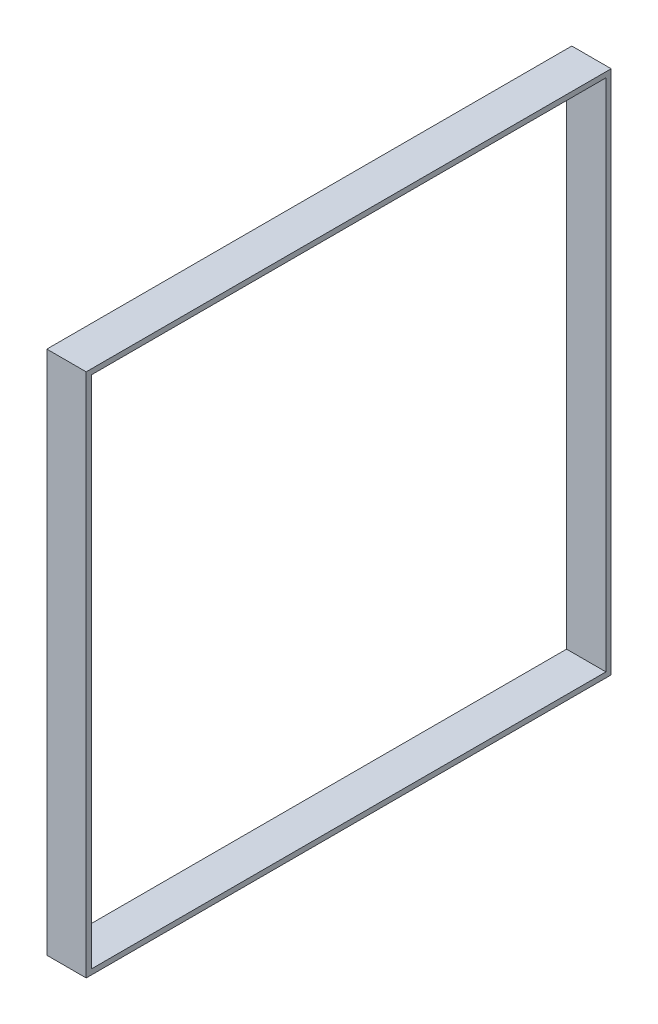
ISO-10303-21;
HEADER;
FILE_DESCRIPTION(('STEP AP214'),'2;1');
FILE_NAME('part.step','',(''),(''),'','','');
FILE_SCHEMA(('AUTOMOTIVE_DESIGN { 1 0 10303 214 1 1 1 1 }'));
ENDSEC;
DATA;
#1=APPLICATION_CONTEXT('core data for automotive mechanical design processes');
#2=APPLICATION_PROTOCOL_DEFINITION('international standard','automotive_design',2000,#1);
#3=PRODUCT_CONTEXT('',#1,'mechanical');
#4=PRODUCT('Part','Part','',(#3));
#5=PRODUCT_RELATED_PRODUCT_CATEGORY('part','',(#4));
#6=PRODUCT_DEFINITION_FORMATION('','',#4);
#7=PRODUCT_DEFINITION_CONTEXT('part definition',#1,'design');
#8=PRODUCT_DEFINITION('design','',#6,#7);
#9=PRODUCT_DEFINITION_SHAPE('','',#8);
#10=(LENGTH_UNIT() NAMED_UNIT(*) SI_UNIT(.MILLI.,.METRE.));
#11=(NAMED_UNIT(*) PLANE_ANGLE_UNIT() SI_UNIT($,.RADIAN.));
#12=(NAMED_UNIT(*) SI_UNIT($,.STERADIAN.) SOLID_ANGLE_UNIT());
#13=UNCERTAINTY_MEASURE_WITH_UNIT(LENGTH_MEASURE(1.E-05),#10,'distance_accuracy_value','');
#14=(GEOMETRIC_REPRESENTATION_CONTEXT(3) GLOBAL_UNCERTAINTY_ASSIGNED_CONTEXT((#13)) GLOBAL_UNIT_ASSIGNED_CONTEXT((#10,
#11,#12)) REPRESENTATION_CONTEXT('',''));
#15=CARTESIAN_POINT('',(0.,0.,0.));
#16=DIRECTION('',(0.,0.,1.));
#17=DIRECTION('',(1.,0.,0.));
#18=AXIS2_PLACEMENT_3D('',#15,#16,#17);
#19=CARTESIAN_POINT('',(150.,0.,0.));
#20=DIRECTION('',(1.,0.,0.));
#21=DIRECTION('',(0.,0.,-1.));
#22=AXIS2_PLACEMENT_3D('',#19,#20,#21);
#23=PLANE('',#22);
#24=DIRECTION('',(0.,1.,0.));
#25=VECTOR('',#24,1.);
#26=CARTESIAN_POINT('',(150.,1000.,-1000.));
#27=LINE('',#26,#25);
#28=CARTESIAN_POINT('',(150.,-1000.,-1000.));
#29=VERTEX_POINT('',#28);
#30=CARTESIAN_POINT('',(150.,1000.,-1000.));
#31=VERTEX_POINT('',#30);
#32=EDGE_CURVE('E162',#29,#31,#27,.T.);
#33=ORIENTED_EDGE('',*,*,#32,.T.);
#34=DIRECTION('',(0.,0.,1.));
#35=VECTOR('',#34,1.);
#36=CARTESIAN_POINT('',(150.,1000.,1000.));
#37=LINE('',#36,#35);
#38=CARTESIAN_POINT('',(150.,1000.,1000.));
#39=VERTEX_POINT('',#38);
#40=EDGE_CURVE('E165',#31,#39,#37,.T.);
#41=ORIENTED_EDGE('',*,*,#40,.T.);
#42=DIRECTION('',(0.,-1.,0.));
#43=VECTOR('',#42,1.);
#44=CARTESIAN_POINT('',(150.,1000.,1000.));
#45=LINE('',#44,#43);
#46=CARTESIAN_POINT('',(150.,-1000.,1000.));
#47=VERTEX_POINT('',#46);
#48=EDGE_CURVE('E168',#39,#47,#45,.T.);
#49=ORIENTED_EDGE('',*,*,#48,.T.);
#50=DIRECTION('',(0.,0.,-1.));
#51=VECTOR('',#50,1.);
#52=CARTESIAN_POINT('',(150.,-1000.,1000.));
#53=LINE('',#52,#51);
#54=EDGE_CURVE('E170',#47,#29,#53,.T.);
#55=ORIENTED_EDGE('',*,*,#54,.T.);
#56=EDGE_LOOP('',(#33,#41,#49,#55));
#57=FACE_BOUND('',#56,.T.);
#58=DIRECTION('',(0.,0.,1.));
#59=VECTOR('',#58,1.);
#60=CARTESIAN_POINT('',(150.,980.,1000.));
#61=LINE('',#60,#59);
#62=CARTESIAN_POINT('',(150.,980.,-980.));
#63=VERTEX_POINT('',#62);
#64=CARTESIAN_POINT('',(150.,980.,980.));
#65=VERTEX_POINT('',#64);
#66=EDGE_CURVE('E134',#63,#65,#61,.T.);
#67=ORIENTED_EDGE('',*,*,#66,.F.);
#68=DIRECTION('',(0.,1.,0.));
#69=VECTOR('',#68,1.);
#70=CARTESIAN_POINT('',(150.,1000.,-980.));
#71=LINE('',#70,#69);
#72=CARTESIAN_POINT('',(150.,-980.,-980.));
#73=VERTEX_POINT('',#72);
#74=EDGE_CURVE('E126',#73,#63,#71,.T.);
#75=ORIENTED_EDGE('',*,*,#74,.F.);
#76=DIRECTION('',(0.,0.,-1.));
#77=VECTOR('',#76,1.);
#78=CARTESIAN_POINT('',(150.,-980.,1000.));
#79=LINE('',#78,#77);
#80=CARTESIAN_POINT('',(150.,-980.,980.));
#81=VERTEX_POINT('',#80);
#82=EDGE_CURVE('E148',#81,#73,#79,.T.);
#83=ORIENTED_EDGE('',*,*,#82,.F.);
#84=DIRECTION('',(0.,-1.,0.));
#85=VECTOR('',#84,1.);
#86=CARTESIAN_POINT('',(150.,1000.,980.));
#87=LINE('',#86,#85);
#88=EDGE_CURVE('E146',#65,#81,#87,.T.);
#89=ORIENTED_EDGE('',*,*,#88,.F.);
#90=EDGE_LOOP('',(#67,#75,#83,#89));
#91=FACE_BOUND('',#90,.T.);
#92=ADVANCED_FACE('F61',(#57,#91),#23,.T.);
#93=CARTESIAN_POINT('',(0.,0.,0.));
#94=DIRECTION('',(1.,0.,0.));
#95=DIRECTION('',(0.,0.,-1.));
#96=AXIS2_PLACEMENT_3D('',#93,#94,#95);
#97=PLANE('',#96);
#98=DIRECTION('',(0.,1.,0.));
#99=VECTOR('',#98,1.);
#100=CARTESIAN_POINT('',(0.,1000.,-1000.));
#101=LINE('',#100,#99);
#102=CARTESIAN_POINT('',(0.,-1000.,-1000.));
#103=VERTEX_POINT('',#102);
#104=CARTESIAN_POINT('',(0.,1000.,-1000.));
#105=VERTEX_POINT('',#104);
#106=EDGE_CURVE('E142',#103,#105,#101,.T.);
#107=ORIENTED_EDGE('',*,*,#106,.F.);
#108=DIRECTION('',(0.,0.,-1.));
#109=VECTOR('',#108,1.);
#110=CARTESIAN_POINT('',(0.,-1000.,1000.));
#111=LINE('',#110,#109);
#112=CARTESIAN_POINT('',(0.,-1000.,1000.));
#113=VERTEX_POINT('',#112);
#114=EDGE_CURVE('E166',#113,#103,#111,.T.);
#115=ORIENTED_EDGE('',*,*,#114,.F.);
#116=DIRECTION('',(0.,-1.,0.));
#117=VECTOR('',#116,1.);
#118=CARTESIAN_POINT('',(0.,1000.,1000.));
#119=LINE('',#118,#117);
#120=CARTESIAN_POINT('',(0.,1000.,1000.));
#121=VERTEX_POINT('',#120);
#122=EDGE_CURVE('E177',#121,#113,#119,.T.);
#123=ORIENTED_EDGE('',*,*,#122,.F.);
#124=DIRECTION('',(0.,0.,1.));
#125=VECTOR('',#124,1.);
#126=CARTESIAN_POINT('',(0.,1000.,1000.));
#127=LINE('',#126,#125);
#128=EDGE_CURVE('E175',#105,#121,#127,.T.);
#129=ORIENTED_EDGE('',*,*,#128,.F.);
#130=EDGE_LOOP('',(#107,#115,#123,#129));
#131=FACE_BOUND('',#130,.T.);
#132=DIRECTION('',(0.,1.,0.));
#133=VECTOR('',#132,1.);
#134=CARTESIAN_POINT('',(0.,1000.,-980.));
#135=LINE('',#134,#133);
#136=CARTESIAN_POINT('',(0.,-980.,-980.));
#137=VERTEX_POINT('',#136);
#138=CARTESIAN_POINT('',(0.,980.,-980.));
#139=VERTEX_POINT('',#138);
#140=EDGE_CURVE('E84',#137,#139,#135,.T.);
#141=ORIENTED_EDGE('',*,*,#140,.T.);
#142=DIRECTION('',(0.,0.,1.));
#143=VECTOR('',#142,1.);
#144=CARTESIAN_POINT('',(0.,980.,1000.));
#145=LINE('',#144,#143);
#146=CARTESIAN_POINT('',(0.,980.,980.));
#147=VERTEX_POINT('',#146);
#148=EDGE_CURVE('E141',#139,#147,#145,.T.);
#149=ORIENTED_EDGE('',*,*,#148,.T.);
#150=DIRECTION('',(0.,-1.,0.));
#151=VECTOR('',#150,1.);
#152=CARTESIAN_POINT('',(0.,1000.,980.));
#153=LINE('',#152,#151);
#154=CARTESIAN_POINT('',(0.,-980.,980.));
#155=VERTEX_POINT('',#154);
#156=EDGE_CURVE('E154',#147,#155,#153,.T.);
#157=ORIENTED_EDGE('',*,*,#156,.T.);
#158=DIRECTION('',(0.,0.,-1.));
#159=VECTOR('',#158,1.);
#160=CARTESIAN_POINT('',(0.,-980.,1000.));
#161=LINE('',#160,#159);
#162=EDGE_CURVE('E135',#155,#137,#161,.T.);
#163=ORIENTED_EDGE('',*,*,#162,.T.);
#164=EDGE_LOOP('',(#141,#149,#157,#163));
#165=FACE_BOUND('',#164,.T.);
#166=ADVANCED_FACE('F195',(#131,#165),#97,.F.);
#167=CARTESIAN_POINT('',(150.,1000.,-1000.));
#168=DIRECTION('',(0.,0.,1.));
#169=DIRECTION('',(0.,-1.,0.));
#170=AXIS2_PLACEMENT_3D('',#167,#168,#169);
#171=PLANE('',#170);
#172=ORIENTED_EDGE('',*,*,#106,.T.);
#173=DIRECTION('',(-1.,0.,0.));
#174=VECTOR('',#173,1.);
#175=CARTESIAN_POINT('',(150.,1000.,-1000.));
#176=LINE('',#175,#174);
#177=EDGE_CURVE('E12',#31,#105,#176,.T.);
#178=ORIENTED_EDGE('',*,*,#177,.F.);
#179=ORIENTED_EDGE('',*,*,#32,.F.);
#180=DIRECTION('',(-1.,0.,0.));
#181=VECTOR('',#180,1.);
#182=CARTESIAN_POINT('',(150.,-1000.,-1000.));
#183=LINE('',#182,#181);
#184=EDGE_CURVE('E172',#29,#103,#183,.T.);
#185=ORIENTED_EDGE('',*,*,#184,.T.);
#186=EDGE_LOOP('',(#172,#178,#179,#185));
#187=FACE_BOUND('',#186,.T.);
#188=ADVANCED_FACE('F63',(#187),#171,.F.);
#189=CARTESIAN_POINT('',(150.,1000.,1000.));
#190=DIRECTION('',(0.,-1.,0.));
#191=DIRECTION('',(0.,0.,-1.));
#192=AXIS2_PLACEMENT_3D('',#189,#190,#191);
#193=PLANE('',#192);
#194=ORIENTED_EDGE('',*,*,#128,.T.);
#195=DIRECTION('',(-1.,0.,0.));
#196=VECTOR('',#195,1.);
#197=CARTESIAN_POINT('',(150.,1000.,1000.));
#198=LINE('',#197,#196);
#199=EDGE_CURVE('E69',#39,#121,#198,.T.);
#200=ORIENTED_EDGE('',*,*,#199,.F.);
#201=ORIENTED_EDGE('',*,*,#40,.F.);
#202=ORIENTED_EDGE('',*,*,#177,.T.);
#203=EDGE_LOOP('',(#194,#200,#201,#202));
#204=FACE_BOUND('',#203,.T.);
#205=ADVANCED_FACE('F205',(#204),#193,.F.);
#206=CARTESIAN_POINT('',(150.,1000.,1000.));
#207=DIRECTION('',(0.,0.,-1.));
#208=DIRECTION('',(0.,1.,0.));
#209=AXIS2_PLACEMENT_3D('',#206,#207,#208);
#210=PLANE('',#209);
#211=ORIENTED_EDGE('',*,*,#122,.T.);
#212=DIRECTION('',(-1.,0.,0.));
#213=VECTOR('',#212,1.);
#214=CARTESIAN_POINT('',(150.,-1000.,1000.));
#215=LINE('',#214,#213);
#216=EDGE_CURVE('E182',#47,#113,#215,.T.);
#217=ORIENTED_EDGE('',*,*,#216,.F.);
#218=ORIENTED_EDGE('',*,*,#48,.F.);
#219=ORIENTED_EDGE('',*,*,#199,.T.);
#220=EDGE_LOOP('',(#211,#217,#218,#219));
#221=FACE_BOUND('',#220,.T.);
#222=ADVANCED_FACE('F189',(#221),#210,.F.);
#223=CARTESIAN_POINT('',(150.,-1000.,1000.));
#224=DIRECTION('',(0.,1.,0.));
#225=DIRECTION('',(0.,0.,1.));
#226=AXIS2_PLACEMENT_3D('',#223,#224,#225);
#227=PLANE('',#226);
#228=ORIENTED_EDGE('',*,*,#114,.T.);
#229=ORIENTED_EDGE('',*,*,#184,.F.);
#230=ORIENTED_EDGE('',*,*,#54,.F.);
#231=ORIENTED_EDGE('',*,*,#216,.T.);
#232=EDGE_LOOP('',(#228,#229,#230,#231));
#233=FACE_BOUND('',#232,.T.);
#234=ADVANCED_FACE('F199',(#233),#227,.F.);
#235=CARTESIAN_POINT('',(150.,1000.,-980.));
#236=DIRECTION('',(0.,0.,1.));
#237=DIRECTION('',(0.,-1.,0.));
#238=AXIS2_PLACEMENT_3D('',#235,#236,#237);
#239=PLANE('',#238);
#240=ORIENTED_EDGE('',*,*,#140,.F.);
#241=DIRECTION('',(-1.,0.,0.));
#242=VECTOR('',#241,1.);
#243=CARTESIAN_POINT('',(150.,-980.,-980.));
#244=LINE('',#243,#242);
#245=EDGE_CURVE('E130',#73,#137,#244,.T.);
#246=ORIENTED_EDGE('',*,*,#245,.F.);
#247=ORIENTED_EDGE('',*,*,#74,.T.);
#248=DIRECTION('',(-1.,0.,0.));
#249=VECTOR('',#248,1.);
#250=CARTESIAN_POINT('',(150.,980.,-980.));
#251=LINE('',#250,#249);
#252=EDGE_CURVE('E129',#63,#139,#251,.T.);
#253=ORIENTED_EDGE('',*,*,#252,.T.);
#254=EDGE_LOOP('',(#240,#246,#247,#253));
#255=FACE_BOUND('',#254,.T.);
#256=ADVANCED_FACE('F128',(#255),#239,.T.);
#257=CARTESIAN_POINT('',(150.,980.,1000.));
#258=DIRECTION('',(0.,-1.,0.));
#259=DIRECTION('',(0.,0.,-1.));
#260=AXIS2_PLACEMENT_3D('',#257,#258,#259);
#261=PLANE('',#260);
#262=ORIENTED_EDGE('',*,*,#148,.F.);
#263=ORIENTED_EDGE('',*,*,#252,.F.);
#264=ORIENTED_EDGE('',*,*,#66,.T.);
#265=DIRECTION('',(-1.,0.,0.));
#266=VECTOR('',#265,1.);
#267=CARTESIAN_POINT('',(150.,980.,980.));
#268=LINE('',#267,#266);
#269=EDGE_CURVE('E143',#65,#147,#268,.T.);
#270=ORIENTED_EDGE('',*,*,#269,.T.);
#271=EDGE_LOOP('',(#262,#263,#264,#270));
#272=FACE_BOUND('',#271,.T.);
#273=ADVANCED_FACE('F138',(#272),#261,.T.);
#274=CARTESIAN_POINT('',(150.,1000.,980.));
#275=DIRECTION('',(0.,0.,-1.));
#276=DIRECTION('',(0.,1.,0.));
#277=AXIS2_PLACEMENT_3D('',#274,#275,#276);
#278=PLANE('',#277);
#279=ORIENTED_EDGE('',*,*,#156,.F.);
#280=ORIENTED_EDGE('',*,*,#269,.F.);
#281=ORIENTED_EDGE('',*,*,#88,.T.);
#282=DIRECTION('',(-1.,0.,0.));
#283=VECTOR('',#282,1.);
#284=CARTESIAN_POINT('',(150.,-980.,980.));
#285=LINE('',#284,#283);
#286=EDGE_CURVE('E76',#81,#155,#285,.T.);
#287=ORIENTED_EDGE('',*,*,#286,.T.);
#288=EDGE_LOOP('',(#279,#280,#281,#287));
#289=FACE_BOUND('',#288,.T.);
#290=ADVANCED_FACE('F228',(#289),#278,.T.);
#291=CARTESIAN_POINT('',(150.,-980.,1000.));
#292=DIRECTION('',(0.,1.,0.));
#293=DIRECTION('',(0.,0.,1.));
#294=AXIS2_PLACEMENT_3D('',#291,#292,#293);
#295=PLANE('',#294);
#296=ORIENTED_EDGE('',*,*,#162,.F.);
#297=ORIENTED_EDGE('',*,*,#286,.F.);
#298=ORIENTED_EDGE('',*,*,#82,.T.);
#299=ORIENTED_EDGE('',*,*,#245,.T.);
#300=EDGE_LOOP('',(#296,#297,#298,#299));
#301=FACE_BOUND('',#300,.T.);
#302=ADVANCED_FACE('F232',(#301),#295,.T.);
#303=CLOSED_SHELL('',(#92,#166,#188,#205,#222,#234,#256,#273,#290,#302));
#304=MANIFOLD_SOLID_BREP('B2',#303);
#305=ADVANCED_BREP_SHAPE_REPRESENTATION('',(#18,#304),#14);
#306=SHAPE_DEFINITION_REPRESENTATION(#9,#305);
ENDSEC;
END-ISO-10303-21;
